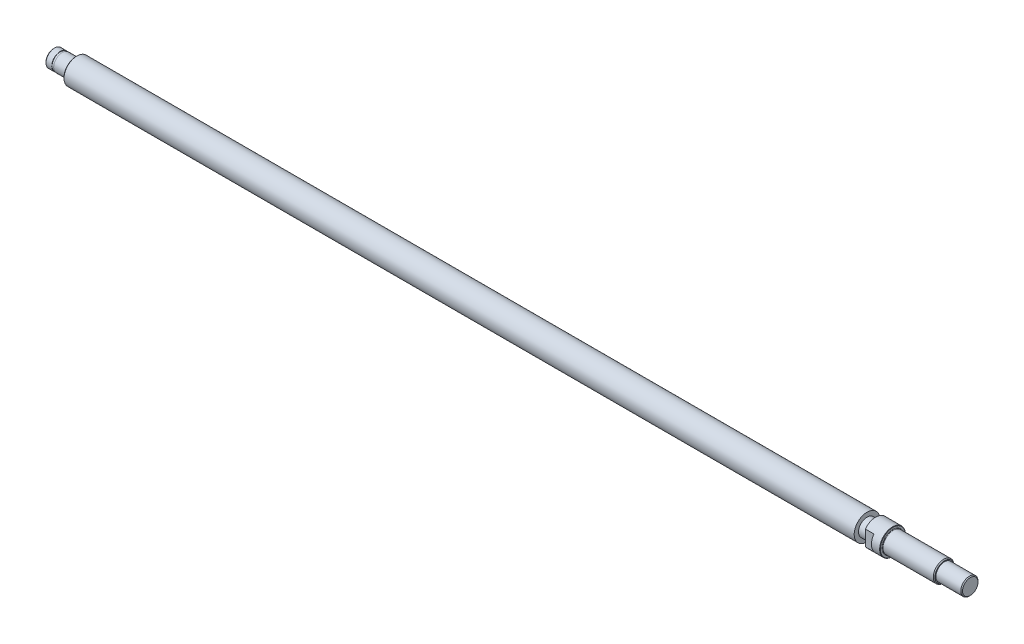
ISO-10303-21;
HEADER;
FILE_DESCRIPTION(('STEP AP214'),'2;1');
FILE_NAME('part.step','',(''),(''),'','','');
FILE_SCHEMA(('AUTOMOTIVE_DESIGN { 1 0 10303 214 1 1 1 1 }'));
ENDSEC;
DATA;
#1=APPLICATION_CONTEXT('core data for automotive mechanical design processes');
#2=APPLICATION_PROTOCOL_DEFINITION('international standard','automotive_design',2000,#1);
#3=PRODUCT_CONTEXT('',#1,'mechanical');
#4=PRODUCT('Part','Part','',(#3));
#5=PRODUCT_RELATED_PRODUCT_CATEGORY('part','',(#4));
#6=PRODUCT_DEFINITION_FORMATION('','',#4);
#7=PRODUCT_DEFINITION_CONTEXT('part definition',#1,'design');
#8=PRODUCT_DEFINITION('design','',#6,#7);
#9=PRODUCT_DEFINITION_SHAPE('','',#8);
#10=(LENGTH_UNIT() NAMED_UNIT(*) SI_UNIT(.MILLI.,.METRE.));
#11=(NAMED_UNIT(*) PLANE_ANGLE_UNIT() SI_UNIT($,.RADIAN.));
#12=(NAMED_UNIT(*) SI_UNIT($,.STERADIAN.) SOLID_ANGLE_UNIT());
#13=UNCERTAINTY_MEASURE_WITH_UNIT(LENGTH_MEASURE(1.E-05),#10,'distance_accuracy_value','');
#14=(GEOMETRIC_REPRESENTATION_CONTEXT(3) GLOBAL_UNCERTAINTY_ASSIGNED_CONTEXT((#13)) GLOBAL_UNIT_ASSIGNED_CONTEXT((#10,
#11,#12)) REPRESENTATION_CONTEXT('',''));
#15=CARTESIAN_POINT('',(0.,0.,0.));
#16=DIRECTION('',(0.,0.,1.));
#17=DIRECTION('',(1.,0.,0.));
#18=AXIS2_PLACEMENT_3D('',#15,#16,#17);
#19=CARTESIAN_POINT('',(533.,0.,0.));
#20=DIRECTION('',(1.,0.,0.));
#21=DIRECTION('',(0.,0.,-1.));
#22=AXIS2_PLACEMENT_3D('',#19,#20,#21);
#23=CYLINDRICAL_SURFACE('',#22,5.);
#24=CARTESIAN_POINT('',(5.,0.,0.));
#25=DIRECTION('',(1.,0.,0.));
#26=DIRECTION('',(0.,0.,-1.));
#27=AXIS2_PLACEMENT_3D('',#24,#25,#26);
#28=CIRCLE('',#27,5.);
#29=CARTESIAN_POINT('',(5.,0.,-5.));
#30=VERTEX_POINT('',#29);
#31=EDGE_CURVE('E5',#30,#30,#28,.T.);
#32=ORIENTED_EDGE('',*,*,#31,.T.);
#33=EDGE_LOOP('',(#32));
#34=FACE_BOUND('',#33,.T.);
#35=CARTESIAN_POINT('',(12.7,0.,0.));
#36=DIRECTION('',(1.,0.,0.));
#37=DIRECTION('',(0.,0.,-1.));
#38=AXIS2_PLACEMENT_3D('',#35,#36,#37);
#39=CIRCLE('',#38,5.);
#40=CARTESIAN_POINT('',(12.7,0.,-5.));
#41=VERTEX_POINT('',#40);
#42=EDGE_CURVE('E9',#41,#41,#39,.T.);
#43=ORIENTED_EDGE('',*,*,#42,.F.);
#44=EDGE_LOOP('',(#43));
#45=FACE_BOUND('',#44,.T.);
#46=ADVANCED_FACE('F13',(#34,#45),#23,.T.);
#47=CARTESIAN_POINT('',(12.7000000000001,0.,0.));
#48=DIRECTION('',(1.,0.,0.));
#49=DIRECTION('',(0.,0.,-1.));
#50=AXIS2_PLACEMENT_3D('',#47,#48,#49);
#51=TOROIDAL_SURFACE('',#50,5.29999999999988,0.29999999999988);
#52=CARTESIAN_POINT('',(13.,0.,0.));
#53=DIRECTION('',(1.,0.,0.));
#54=DIRECTION('',(0.,0.,-1.));
#55=AXIS2_PLACEMENT_3D('',#52,#53,#54);
#56=CIRCLE('',#55,5.29999999999988);
#57=CARTESIAN_POINT('',(13.,0.,-5.29999999999988));
#58=VERTEX_POINT('',#57);
#59=EDGE_CURVE('E24',#58,#58,#56,.T.);
#60=ORIENTED_EDGE('',*,*,#59,.F.);
#61=EDGE_LOOP('',(#60));
#62=FACE_BOUND('',#61,.T.);
#63=ORIENTED_EDGE('',*,*,#42,.T.);
#64=EDGE_LOOP('',(#63));
#65=FACE_BOUND('',#64,.T.);
#66=ADVANCED_FACE('F30',(#62,#65),#51,.F.);
#67=CARTESIAN_POINT('',(13.,5.3,0.));
#68=DIRECTION('',(1.,0.,0.));
#69=DIRECTION('',(0.,0.,-1.));
#70=AXIS2_PLACEMENT_3D('',#67,#68,#69);
#71=PLANE('',#70);
#72=CARTESIAN_POINT('',(13.,0.,0.));
#73=DIRECTION('',(1.,0.,0.));
#74=DIRECTION('',(0.,0.,-1.));
#75=AXIS2_PLACEMENT_3D('',#72,#73,#74);
#76=CIRCLE('',#75,7.);
#77=CARTESIAN_POINT('',(13.,0.,-7.));
#78=VERTEX_POINT('',#77);
#79=EDGE_CURVE('E37',#78,#78,#76,.T.);
#80=ORIENTED_EDGE('',*,*,#79,.F.);
#81=EDGE_LOOP('',(#80));
#82=FACE_BOUND('',#81,.T.);
#83=ORIENTED_EDGE('',*,*,#59,.T.);
#84=EDGE_LOOP('',(#83));
#85=FACE_BOUND('',#84,.T.);
#86=ADVANCED_FACE('F43',(#82,#85),#71,.F.);
#87=CARTESIAN_POINT('',(13.,0.,0.));
#88=DIRECTION('',(1.,0.,0.));
#89=DIRECTION('',(0.,0.,-1.));
#90=AXIS2_PLACEMENT_3D('',#87,#88,#89);
#91=CONICAL_SURFACE('',#90,7.,0.785398163397503);
#92=CARTESIAN_POINT('',(13.5,0.,0.));
#93=DIRECTION('',(1.,0.,0.));
#94=DIRECTION('',(0.,0.,-1.));
#95=AXIS2_PLACEMENT_3D('',#92,#93,#94);
#96=CIRCLE('',#95,7.5);
#97=CARTESIAN_POINT('',(13.5,0.,-7.5));
#98=VERTEX_POINT('',#97);
#99=EDGE_CURVE('E50',#98,#98,#96,.T.);
#100=ORIENTED_EDGE('',*,*,#99,.F.);
#101=EDGE_LOOP('',(#100));
#102=FACE_BOUND('',#101,.T.);
#103=ORIENTED_EDGE('',*,*,#79,.T.);
#104=EDGE_LOOP('',(#103));
#105=FACE_BOUND('',#104,.T.);
#106=ADVANCED_FACE('F56',(#102,#105),#91,.T.);
#107=CARTESIAN_POINT('',(533.,0.,0.));
#108=DIRECTION('',(1.,0.,0.));
#109=DIRECTION('',(0.,0.,-1.));
#110=AXIS2_PLACEMENT_3D('',#107,#108,#109);
#111=CYLINDRICAL_SURFACE('',#110,7.5);
#112=CARTESIAN_POINT('',(473.,0.,0.));
#113=DIRECTION('',(1.,0.,0.));
#114=DIRECTION('',(0.,0.,-1.));
#115=AXIS2_PLACEMENT_3D('',#112,#113,#114);
#116=CIRCLE('',#115,7.5);
#117=CARTESIAN_POINT('',(473.,0.,-7.5));
#118=VERTEX_POINT('',#117);
#119=EDGE_CURVE('E63',#118,#118,#116,.T.);
#120=ORIENTED_EDGE('',*,*,#119,.F.);
#121=EDGE_LOOP('',(#120));
#122=FACE_BOUND('',#121,.T.);
#123=ORIENTED_EDGE('',*,*,#99,.T.);
#124=EDGE_LOOP('',(#123));
#125=FACE_BOUND('',#124,.T.);
#126=ADVANCED_FACE('F69',(#122,#125),#111,.T.);
#127=CARTESIAN_POINT('',(473.,7.5,0.));
#128=DIRECTION('',(-1.,0.,0.));
#129=DIRECTION('',(0.,0.,1.));
#130=AXIS2_PLACEMENT_3D('',#127,#128,#129);
#131=PLANE('',#130);
#132=CARTESIAN_POINT('',(473.,0.,0.));
#133=DIRECTION('',(1.,0.,0.));
#134=DIRECTION('',(0.,0.,-1.));
#135=AXIS2_PLACEMENT_3D('',#132,#133,#134);
#136=CIRCLE('',#135,5.);
#137=CARTESIAN_POINT('',(473.,0.,-5.));
#138=VERTEX_POINT('',#137);
#139=EDGE_CURVE('E76',#138,#138,#136,.T.);
#140=ORIENTED_EDGE('',*,*,#139,.F.);
#141=EDGE_LOOP('',(#140));
#142=FACE_BOUND('',#141,.T.);
#143=ORIENTED_EDGE('',*,*,#119,.T.);
#144=EDGE_LOOP('',(#143));
#145=FACE_BOUND('',#144,.T.);
#146=ADVANCED_FACE('F82',(#142,#145),#131,.F.);
#147=CARTESIAN_POINT('',(533.,0.,0.));
#148=DIRECTION('',(1.,0.,0.));
#149=DIRECTION('',(0.,0.,-1.));
#150=AXIS2_PLACEMENT_3D('',#147,#148,#149);
#151=CYLINDRICAL_SURFACE('',#150,5.);
#152=CARTESIAN_POINT('',(478.,0.,0.));
#153=DIRECTION('',(1.,0.,0.));
#154=DIRECTION('',(0.,0.,-1.));
#155=AXIS2_PLACEMENT_3D('',#152,#153,#154);
#156=CIRCLE('',#155,5.);
#157=CARTESIAN_POINT('',(478.,0.,-5.));
#158=VERTEX_POINT('',#157);
#159=EDGE_CURVE('E89',#158,#158,#156,.T.);
#160=ORIENTED_EDGE('',*,*,#159,.F.);
#161=EDGE_LOOP('',(#160));
#162=FACE_BOUND('',#161,.T.);
#163=ORIENTED_EDGE('',*,*,#139,.T.);
#164=EDGE_LOOP('',(#163));
#165=FACE_BOUND('',#164,.T.);
#166=ADVANCED_FACE('F95',(#162,#165),#151,.T.);
#167=CARTESIAN_POINT('',(478.,5.,0.));
#168=DIRECTION('',(1.,0.,0.));
#169=DIRECTION('',(0.,0.,-1.));
#170=AXIS2_PLACEMENT_3D('',#167,#168,#169);
#171=PLANE('',#170);
#172=CARTESIAN_POINT('',(478.,0.,0.));
#173=DIRECTION('',(1.,0.,0.));
#174=DIRECTION('',(0.,-0.6,0.8));
#175=AXIS2_PLACEMENT_3D('',#172,#173,#174);
#176=CIRCLE('',#175,7.5);
#177=CARTESIAN_POINT('',(478.,-4.5,6.));
#178=VERTEX_POINT('',#177);
#179=CARTESIAN_POINT('',(478.,-4.5,-6.));
#180=VERTEX_POINT('',#179);
#181=EDGE_CURVE('E104',#178,#180,#176,.T.);
#182=ORIENTED_EDGE('',*,*,#181,.F.);
#183=DIRECTION('',(0.,-1.,0.));
#184=VECTOR('',#183,1.);
#185=CARTESIAN_POINT('',(478.,4.5,6.));
#186=LINE('',#185,#184);
#187=CARTESIAN_POINT('',(478.,4.5,6.));
#188=VERTEX_POINT('',#187);
#189=EDGE_CURVE('E111',#188,#178,#186,.T.);
#190=ORIENTED_EDGE('',*,*,#189,.F.);
#191=CARTESIAN_POINT('',(478.,0.,0.));
#192=DIRECTION('',(1.,0.,0.));
#193=DIRECTION('',(0.,0.6,-0.8));
#194=AXIS2_PLACEMENT_3D('',#191,#192,#193);
#195=CIRCLE('',#194,7.5);
#196=CARTESIAN_POINT('',(478.,4.5,-6.));
#197=VERTEX_POINT('',#196);
#198=EDGE_CURVE('E118',#197,#188,#195,.T.);
#199=ORIENTED_EDGE('',*,*,#198,.F.);
#200=DIRECTION('',(0.,1.,0.));
#201=VECTOR('',#200,1.);
#202=CARTESIAN_POINT('',(478.,-4.5,-6.));
#203=LINE('',#202,#201);
#204=EDGE_CURVE('E125',#180,#197,#203,.T.);
#205=ORIENTED_EDGE('',*,*,#204,.F.);
#206=EDGE_LOOP('',(#182,#190,#199,#205));
#207=FACE_BOUND('',#206,.T.);
#208=ORIENTED_EDGE('',*,*,#159,.T.);
#209=EDGE_LOOP('',(#208));
#210=FACE_BOUND('',#209,.T.);
#211=ADVANCED_FACE('F133',(#207,#210),#171,.F.);
#212=CARTESIAN_POINT('',(533.,0.,0.));
#213=DIRECTION('',(1.,0.,0.));
#214=DIRECTION('',(0.,0.,-1.));
#215=AXIS2_PLACEMENT_3D('',#212,#213,#214);
#216=CYLINDRICAL_SURFACE('',#215,7.5);
#217=ORIENTED_EDGE('',*,*,#198,.T.);
#218=DIRECTION('',(1.,0.,0.));
#219=VECTOR('',#218,1.);
#220=CARTESIAN_POINT('',(478.,4.5,6.));
#221=LINE('',#220,#219);
#222=CARTESIAN_POINT('',(483.,4.5,6.));
#223=VERTEX_POINT('',#222);
#224=EDGE_CURVE('E143',#188,#223,#221,.T.);
#225=ORIENTED_EDGE('',*,*,#224,.T.);
#226=CARTESIAN_POINT('',(483.,0.,0.));
#227=DIRECTION('',(1.,0.,0.));
#228=DIRECTION('',(0.,0.6,0.8));
#229=AXIS2_PLACEMENT_3D('',#226,#227,#228);
#230=CIRCLE('',#229,7.5);
#231=CARTESIAN_POINT('',(483.,-4.5,6.));
#232=VERTEX_POINT('',#231);
#233=EDGE_CURVE('E150',#223,#232,#230,.T.);
#234=ORIENTED_EDGE('',*,*,#233,.T.);
#235=DIRECTION('',(-1.,0.,0.));
#236=VECTOR('',#235,1.);
#237=CARTESIAN_POINT('',(483.,-4.5,6.));
#238=LINE('',#237,#236);
#239=EDGE_CURVE('E157',#232,#178,#238,.T.);
#240=ORIENTED_EDGE('',*,*,#239,.T.);
#241=ORIENTED_EDGE('',*,*,#181,.T.);
#242=DIRECTION('',(1.,0.,0.));
#243=VECTOR('',#242,1.);
#244=CARTESIAN_POINT('',(478.,-4.5,-6.));
#245=LINE('',#244,#243);
#246=CARTESIAN_POINT('',(483.,-4.5,-6.));
#247=VERTEX_POINT('',#246);
#248=EDGE_CURVE('E163',#180,#247,#245,.T.);
#249=ORIENTED_EDGE('',*,*,#248,.T.);
#250=CARTESIAN_POINT('',(483.,0.,0.));
#251=DIRECTION('',(1.,0.,0.));
#252=DIRECTION('',(0.,-0.6,-0.8));
#253=AXIS2_PLACEMENT_3D('',#250,#251,#252);
#254=CIRCLE('',#253,7.5);
#255=CARTESIAN_POINT('',(483.,4.5,-6.));
#256=VERTEX_POINT('',#255);
#257=EDGE_CURVE('E170',#247,#256,#254,.T.);
#258=ORIENTED_EDGE('',*,*,#257,.T.);
#259=DIRECTION('',(-1.,0.,0.));
#260=VECTOR('',#259,1.);
#261=CARTESIAN_POINT('',(483.,4.5,-6.));
#262=LINE('',#261,#260);
#263=EDGE_CURVE('E177',#256,#197,#262,.T.);
#264=ORIENTED_EDGE('',*,*,#263,.T.);
#265=EDGE_LOOP('',(#217,#225,#234,#240,#241,#249,#258,#264));
#266=FACE_BOUND('',#265,.T.);
#267=CARTESIAN_POINT('',(487.8,0.,0.));
#268=DIRECTION('',(1.,0.,0.));
#269=DIRECTION('',(0.,0.,-1.));
#270=AXIS2_PLACEMENT_3D('',#267,#268,#269);
#271=CIRCLE('',#270,7.5);
#272=CARTESIAN_POINT('',(487.8,0.,-7.5));
#273=VERTEX_POINT('',#272);
#274=EDGE_CURVE('E181',#273,#273,#271,.T.);
#275=ORIENTED_EDGE('',*,*,#274,.F.);
#276=EDGE_LOOP('',(#275));
#277=FACE_BOUND('',#276,.T.);
#278=ADVANCED_FACE('F185',(#266,#277),#216,.T.);
#279=CARTESIAN_POINT('',(487.8,0.,0.));
#280=DIRECTION('',(-1.,0.,0.));
#281=DIRECTION('',(0.,0.,1.));
#282=AXIS2_PLACEMENT_3D('',#279,#280,#281);
#283=CONICAL_SURFACE('',#282,7.5,0.785398163397503);
#284=CARTESIAN_POINT('',(488.,0.,0.));
#285=DIRECTION('',(1.,0.,0.));
#286=DIRECTION('',(0.,0.,-1.));
#287=AXIS2_PLACEMENT_3D('',#284,#285,#286);
#288=CIRCLE('',#287,7.29999999999999);
#289=CARTESIAN_POINT('',(488.,0.,-7.29999999999999));
#290=VERTEX_POINT('',#289);
#291=EDGE_CURVE('E192',#290,#290,#288,.T.);
#292=ORIENTED_EDGE('',*,*,#291,.F.);
#293=EDGE_LOOP('',(#292));
#294=FACE_BOUND('',#293,.T.);
#295=ORIENTED_EDGE('',*,*,#274,.T.);
#296=EDGE_LOOP('',(#295));
#297=FACE_BOUND('',#296,.T.);
#298=ADVANCED_FACE('F198',(#294,#297),#283,.T.);
#299=CARTESIAN_POINT('',(488.,7.3,0.));
#300=DIRECTION('',(-1.,0.,0.));
#301=DIRECTION('',(0.,0.,1.));
#302=AXIS2_PLACEMENT_3D('',#299,#300,#301);
#303=PLANE('',#302);
#304=CARTESIAN_POINT('',(488.,0.,0.));
#305=DIRECTION('',(1.,0.,0.));
#306=DIRECTION('',(0.,0.,-1.));
#307=AXIS2_PLACEMENT_3D('',#304,#305,#306);
#308=CIRCLE('',#307,6.30000037178547);
#309=CARTESIAN_POINT('',(488.,0.,-6.30000037178547));
#310=VERTEX_POINT('',#309);
#311=EDGE_CURVE('E205',#310,#310,#308,.T.);
#312=ORIENTED_EDGE('',*,*,#311,.F.);
#313=EDGE_LOOP('',(#312));
#314=FACE_BOUND('',#313,.T.);
#315=ORIENTED_EDGE('',*,*,#291,.T.);
#316=EDGE_LOOP('',(#315));
#317=FACE_BOUND('',#316,.T.);
#318=ADVANCED_FACE('F211',(#314,#317),#303,.F.);
#319=CARTESIAN_POINT('',(488.299999999993,0.,0.));
#320=DIRECTION('',(1.,0.,0.));
#321=DIRECTION('',(0.,0.,-1.));
#322=AXIS2_PLACEMENT_3D('',#319,#320,#321);
#323=TOROIDAL_SURFACE('',#322,6.29999999999329,0.29999999999325);
#324=CARTESIAN_POINT('',(488.3,0.,0.));
#325=DIRECTION('',(1.,0.,0.));
#326=DIRECTION('',(0.,0.,-1.));
#327=AXIS2_PLACEMENT_3D('',#324,#325,#326);
#328=CIRCLE('',#327,6.);
#329=CARTESIAN_POINT('',(488.3,0.,-6.));
#330=VERTEX_POINT('',#329);
#331=EDGE_CURVE('E218',#330,#330,#328,.T.);
#332=ORIENTED_EDGE('',*,*,#331,.F.);
#333=EDGE_LOOP('',(#332));
#334=FACE_BOUND('',#333,.T.);
#335=ORIENTED_EDGE('',*,*,#311,.T.);
#336=EDGE_LOOP('',(#335));
#337=FACE_BOUND('',#336,.T.);
#338=ADVANCED_FACE('F224',(#334,#337),#323,.F.);
#339=CARTESIAN_POINT('',(533.,0.,0.));
#340=DIRECTION('',(1.,0.,0.));
#341=DIRECTION('',(0.,0.,-1.));
#342=AXIS2_PLACEMENT_3D('',#339,#340,#341);
#343=CYLINDRICAL_SURFACE('',#342,6.);
#344=CARTESIAN_POINT('',(517.5,0.,0.));
#345=DIRECTION('',(1.,0.,0.));
#346=DIRECTION('',(0.,0.,-1.));
#347=AXIS2_PLACEMENT_3D('',#344,#345,#346);
#348=CIRCLE('',#347,6.);
#349=CARTESIAN_POINT('',(517.5,0.,-6.));
#350=VERTEX_POINT('',#349);
#351=EDGE_CURVE('E231',#350,#350,#348,.T.);
#352=ORIENTED_EDGE('',*,*,#351,.F.);
#353=EDGE_LOOP('',(#352));
#354=FACE_BOUND('',#353,.T.);
#355=ORIENTED_EDGE('',*,*,#331,.T.);
#356=EDGE_LOOP('',(#355));
#357=FACE_BOUND('',#356,.T.);
#358=ADVANCED_FACE('F237',(#354,#357),#343,.T.);
#359=CARTESIAN_POINT('',(517.5,0.,0.));
#360=DIRECTION('',(-1.,0.,0.));
#361=DIRECTION('',(0.,0.,1.));
#362=AXIS2_PLACEMENT_3D('',#359,#360,#361);
#363=CONICAL_SURFACE('',#362,6.,0.785398163397393);
#364=CARTESIAN_POINT('',(518.,0.,0.));
#365=DIRECTION('',(1.,0.,0.));
#366=DIRECTION('',(0.,0.,-1.));
#367=AXIS2_PLACEMENT_3D('',#364,#365,#366);
#368=CIRCLE('',#367,5.50000000000006);
#369=CARTESIAN_POINT('',(518.,0.,-5.50000000000006));
#370=VERTEX_POINT('',#369);
#371=EDGE_CURVE('E244',#370,#370,#368,.T.);
#372=ORIENTED_EDGE('',*,*,#371,.F.);
#373=EDGE_LOOP('',(#372));
#374=FACE_BOUND('',#373,.T.);
#375=ORIENTED_EDGE('',*,*,#351,.T.);
#376=EDGE_LOOP('',(#375));
#377=FACE_BOUND('',#376,.T.);
#378=ADVANCED_FACE('F250',(#374,#377),#363,.T.);
#379=CARTESIAN_POINT('',(518.,5.5,0.));
#380=DIRECTION('',(-1.,0.,0.));
#381=DIRECTION('',(0.,0.,1.));
#382=AXIS2_PLACEMENT_3D('',#379,#380,#381);
#383=PLANE('',#382);
#384=CARTESIAN_POINT('',(518.,0.,0.));
#385=DIRECTION('',(1.,0.,0.));
#386=DIRECTION('',(0.,0.,-1.));
#387=AXIS2_PLACEMENT_3D('',#384,#385,#386);
#388=CIRCLE('',#387,5.);
#389=CARTESIAN_POINT('',(518.,0.,-5.));
#390=VERTEX_POINT('',#389);
#391=EDGE_CURVE('E257',#390,#390,#388,.T.);
#392=ORIENTED_EDGE('',*,*,#391,.F.);
#393=EDGE_LOOP('',(#392));
#394=FACE_BOUND('',#393,.T.);
#395=ORIENTED_EDGE('',*,*,#371,.T.);
#396=EDGE_LOOP('',(#395));
#397=FACE_BOUND('',#396,.T.);
#398=ADVANCED_FACE('F263',(#394,#397),#383,.F.);
#399=CARTESIAN_POINT('',(533.,0.,0.));
#400=DIRECTION('',(1.,0.,0.));
#401=DIRECTION('',(0.,0.,-1.));
#402=AXIS2_PLACEMENT_3D('',#399,#400,#401);
#403=CYLINDRICAL_SURFACE('',#402,5.);
#404=CARTESIAN_POINT('',(532.5,0.,0.));
#405=DIRECTION('',(1.,0.,0.));
#406=DIRECTION('',(0.,0.,-1.));
#407=AXIS2_PLACEMENT_3D('',#404,#405,#406);
#408=CIRCLE('',#407,5.);
#409=CARTESIAN_POINT('',(532.5,0.,-5.));
#410=VERTEX_POINT('',#409);
#411=EDGE_CURVE('E270',#410,#410,#408,.T.);
#412=ORIENTED_EDGE('',*,*,#411,.F.);
#413=EDGE_LOOP('',(#412));
#414=FACE_BOUND('',#413,.T.);
#415=ORIENTED_EDGE('',*,*,#391,.T.);
#416=EDGE_LOOP('',(#415));
#417=FACE_BOUND('',#416,.T.);
#418=ADVANCED_FACE('F276',(#414,#417),#403,.T.);
#419=CARTESIAN_POINT('',(532.5,0.,0.));
#420=DIRECTION('',(-1.,0.,0.));
#421=DIRECTION('',(0.,0.,1.));
#422=AXIS2_PLACEMENT_3D('',#419,#420,#421);
#423=CONICAL_SURFACE('',#422,5.,0.785398163397393);
#424=CARTESIAN_POINT('',(533.,0.,0.));
#425=DIRECTION('',(1.,0.,0.));
#426=DIRECTION('',(0.,0.,-1.));
#427=AXIS2_PLACEMENT_3D('',#424,#425,#426);
#428=CIRCLE('',#427,4.50000000000006);
#429=CARTESIAN_POINT('',(533.,0.,-4.50000000000006));
#430=VERTEX_POINT('',#429);
#431=EDGE_CURVE('E283',#430,#430,#428,.T.);
#432=ORIENTED_EDGE('',*,*,#431,.F.);
#433=EDGE_LOOP('',(#432));
#434=FACE_BOUND('',#433,.T.);
#435=ORIENTED_EDGE('',*,*,#411,.T.);
#436=EDGE_LOOP('',(#435));
#437=FACE_BOUND('',#436,.T.);
#438=ADVANCED_FACE('F289',(#434,#437),#423,.T.);
#439=CARTESIAN_POINT('',(533.,4.5,0.));
#440=DIRECTION('',(-1.,0.,0.));
#441=DIRECTION('',(0.,0.,1.));
#442=AXIS2_PLACEMENT_3D('',#439,#440,#441);
#443=PLANE('',#442);
#444=ORIENTED_EDGE('',*,*,#431,.T.);
#445=EDGE_LOOP('',(#444));
#446=FACE_BOUND('',#445,.T.);
#447=ADVANCED_FACE('F298',(#446),#443,.F.);
#448=CARTESIAN_POINT('',(483.,0.,0.));
#449=DIRECTION('',(1.,0.,0.));
#450=DIRECTION('',(0.,0.,-1.));
#451=AXIS2_PLACEMENT_3D('',#448,#449,#450);
#452=PLANE('',#451);
#453=DIRECTION('',(0.,1.,0.));
#454=VECTOR('',#453,1.);
#455=CARTESIAN_POINT('',(483.,-4.5,-6.));
#456=LINE('',#455,#454);
#457=EDGE_CURVE('E307',#247,#256,#456,.T.);
#458=ORIENTED_EDGE('',*,*,#457,.T.);
#459=ORIENTED_EDGE('',*,*,#257,.F.);
#460=EDGE_LOOP('',(#458,#459));
#461=FACE_BOUND('',#460,.T.);
#462=ADVANCED_FACE('F312',(#461),#452,.F.);
#463=CARTESIAN_POINT('',(483.,-7.5,-6.));
#464=DIRECTION('',(0.,0.,1.));
#465=DIRECTION('',(1.,0.,0.));
#466=AXIS2_PLACEMENT_3D('',#463,#464,#465);
#467=PLANE('',#466);
#468=ORIENTED_EDGE('',*,*,#204,.T.);
#469=ORIENTED_EDGE('',*,*,#263,.F.);
#470=ORIENTED_EDGE('',*,*,#457,.F.);
#471=ORIENTED_EDGE('',*,*,#248,.F.);
#472=EDGE_LOOP('',(#468,#469,#470,#471));
#473=FACE_BOUND('',#472,.T.);
#474=ADVANCED_FACE('F324',(#473),#467,.F.);
#475=CARTESIAN_POINT('',(483.,7.5,6.));
#476=DIRECTION('',(0.,0.,-1.));
#477=DIRECTION('',(-1.,0.,0.));
#478=AXIS2_PLACEMENT_3D('',#475,#476,#477);
#479=PLANE('',#478);
#480=ORIENTED_EDGE('',*,*,#189,.T.);
#481=ORIENTED_EDGE('',*,*,#239,.F.);
#482=DIRECTION('',(0.,-1.,0.));
#483=VECTOR('',#482,1.);
#484=CARTESIAN_POINT('',(483.,4.5,6.));
#485=LINE('',#484,#483);
#486=EDGE_CURVE('E335',#223,#232,#485,.T.);
#487=ORIENTED_EDGE('',*,*,#486,.F.);
#488=ORIENTED_EDGE('',*,*,#224,.F.);
#489=EDGE_LOOP('',(#480,#481,#487,#488));
#490=FACE_BOUND('',#489,.T.);
#491=ADVANCED_FACE('F340',(#490),#479,.F.);
#492=ORIENTED_EDGE('',*,*,#486,.T.);
#493=ORIENTED_EDGE('',*,*,#233,.F.);
#494=EDGE_LOOP('',(#492,#493));
#495=FACE_BOUND('',#494,.T.);
#496=ADVANCED_FACE('F349',(#495),#452,.F.);
#497=CARTESIAN_POINT('',(3.85,7.5,0.));
#498=DIRECTION('',(-1.,0.,0.));
#499=DIRECTION('',(0.,0.,1.));
#500=AXIS2_PLACEMENT_3D('',#497,#498,#499);
#501=PLANE('',#500);
#502=CARTESIAN_POINT('',(3.85,0.,0.));
#503=DIRECTION('',(1.,0.,0.));
#504=DIRECTION('',(0.,0.,-1.));
#505=AXIS2_PLACEMENT_3D('',#502,#503,#504);
#506=CIRCLE('',#505,4.8);
#507=CARTESIAN_POINT('',(3.85,0.,-4.8));
#508=VERTEX_POINT('',#507);
#509=EDGE_CURVE('E356',#508,#508,#506,.T.);
#510=ORIENTED_EDGE('',*,*,#509,.F.);
#511=EDGE_LOOP('',(#510));
#512=FACE_BOUND('',#511,.T.);
#513=CARTESIAN_POINT('',(3.85000000000002,0.,0.));
#514=DIRECTION('',(-1.,0.,0.));
#515=DIRECTION('',(0.,0.,1.));
#516=AXIS2_PLACEMENT_3D('',#513,#514,#515);
#517=CIRCLE('',#516,5.);
#518=CARTESIAN_POINT('',(3.85000000000002,0.,5.));
#519=VERTEX_POINT('',#518);
#520=EDGE_CURVE('E360',#519,#519,#517,.T.);
#521=ORIENTED_EDGE('',*,*,#520,.F.);
#522=EDGE_LOOP('',(#521));
#523=FACE_BOUND('',#522,.T.);
#524=ADVANCED_FACE('F364',(#512,#523),#501,.F.);
#525=CARTESIAN_POINT('',(5.,4.8,0.));
#526=DIRECTION('',(1.,0.,0.));
#527=DIRECTION('',(0.,0.,-1.));
#528=AXIS2_PLACEMENT_3D('',#525,#526,#527);
#529=PLANE('',#528);
#530=CARTESIAN_POINT('',(5.,0.,0.));
#531=DIRECTION('',(1.,0.,0.));
#532=DIRECTION('',(0.,0.,-1.));
#533=AXIS2_PLACEMENT_3D('',#530,#531,#532);
#534=CIRCLE('',#533,4.8);
#535=CARTESIAN_POINT('',(5.,0.,-4.8));
#536=VERTEX_POINT('',#535);
#537=EDGE_CURVE('E371',#536,#536,#534,.T.);
#538=ORIENTED_EDGE('',*,*,#537,.T.);
#539=EDGE_LOOP('',(#538));
#540=FACE_BOUND('',#539,.T.);
#541=ORIENTED_EDGE('',*,*,#31,.F.);
#542=EDGE_LOOP('',(#541));
#543=FACE_BOUND('',#542,.T.);
#544=ADVANCED_FACE('F377',(#540,#543),#529,.F.);
#545=CARTESIAN_POINT('',(5.,0.,0.));
#546=DIRECTION('',(1.,0.,0.));
#547=DIRECTION('',(0.,0.,-1.));
#548=AXIS2_PLACEMENT_3D('',#545,#546,#547);
#549=CYLINDRICAL_SURFACE('',#548,4.8);
#550=ORIENTED_EDGE('',*,*,#537,.F.);
#551=EDGE_LOOP('',(#550));
#552=FACE_BOUND('',#551,.T.);
#553=ORIENTED_EDGE('',*,*,#509,.T.);
#554=EDGE_LOOP('',(#553));
#555=FACE_BOUND('',#554,.T.);
#556=ADVANCED_FACE('F388',(#552,#555),#549,.T.);
#557=CARTESIAN_POINT('',(0.,0.,0.));
#558=DIRECTION('',(1.,0.,0.));
#559=DIRECTION('',(0.,0.,-1.));
#560=AXIS2_PLACEMENT_3D('',#557,#558,#559);
#561=PLANE('',#560);
#562=CARTESIAN_POINT('',(0.,0.,0.));
#563=DIRECTION('',(1.,0.,0.));
#564=DIRECTION('',(0.,0.,-1.));
#565=AXIS2_PLACEMENT_3D('',#562,#563,#564);
#566=CIRCLE('',#565,4.5);
#567=CARTESIAN_POINT('',(0.,0.,-4.5));
#568=VERTEX_POINT('',#567);
#569=EDGE_CURVE('E395',#568,#568,#566,.T.);
#570=ORIENTED_EDGE('',*,*,#569,.F.);
#571=EDGE_LOOP('',(#570));
#572=FACE_BOUND('',#571,.T.);
#573=ADVANCED_FACE('F399',(#572),#561,.F.);
#574=CARTESIAN_POINT('',(0.,0.,0.));
#575=DIRECTION('',(1.,0.,0.));
#576=DIRECTION('',(0.,0.,-1.));
#577=AXIS2_PLACEMENT_3D('',#574,#575,#576);
#578=CONICAL_SURFACE('',#577,4.5,0.785398163397503);
#579=CARTESIAN_POINT('',(0.5,0.,0.));
#580=DIRECTION('',(1.,0.,0.));
#581=DIRECTION('',(0.,0.,-1.));
#582=AXIS2_PLACEMENT_3D('',#579,#580,#581);
#583=CIRCLE('',#582,5.);
#584=CARTESIAN_POINT('',(0.5,0.,-5.));
#585=VERTEX_POINT('',#584);
#586=EDGE_CURVE('E406',#585,#585,#583,.T.);
#587=ORIENTED_EDGE('',*,*,#586,.F.);
#588=EDGE_LOOP('',(#587));
#589=FACE_BOUND('',#588,.T.);
#590=ORIENTED_EDGE('',*,*,#569,.T.);
#591=EDGE_LOOP('',(#590));
#592=FACE_BOUND('',#591,.T.);
#593=ADVANCED_FACE('F412',(#589,#592),#578,.T.);
#594=ORIENTED_EDGE('',*,*,#520,.T.);
#595=EDGE_LOOP('',(#594));
#596=FACE_BOUND('',#595,.T.);
#597=ORIENTED_EDGE('',*,*,#586,.T.);
#598=EDGE_LOOP('',(#597));
#599=FACE_BOUND('',#598,.T.);
#600=ADVANCED_FACE('F422',(#596,#599),#23,.T.);
#601=CLOSED_SHELL('',(#46,#66,#86,#106,#126,#146,#166,#211,#278,#298,#318,#338,#358,#378,#398,
#418,#438,#447,#462,#474,#491,#496,#524,#544,#556,#573,#593,#600));
#602=MANIFOLD_SOLID_BREP('B1',#601);
#603=ADVANCED_BREP_SHAPE_REPRESENTATION('',(#18,#602),#14);
#604=SHAPE_DEFINITION_REPRESENTATION(#9,#603);
ENDSEC;
END-ISO-10303-21;
